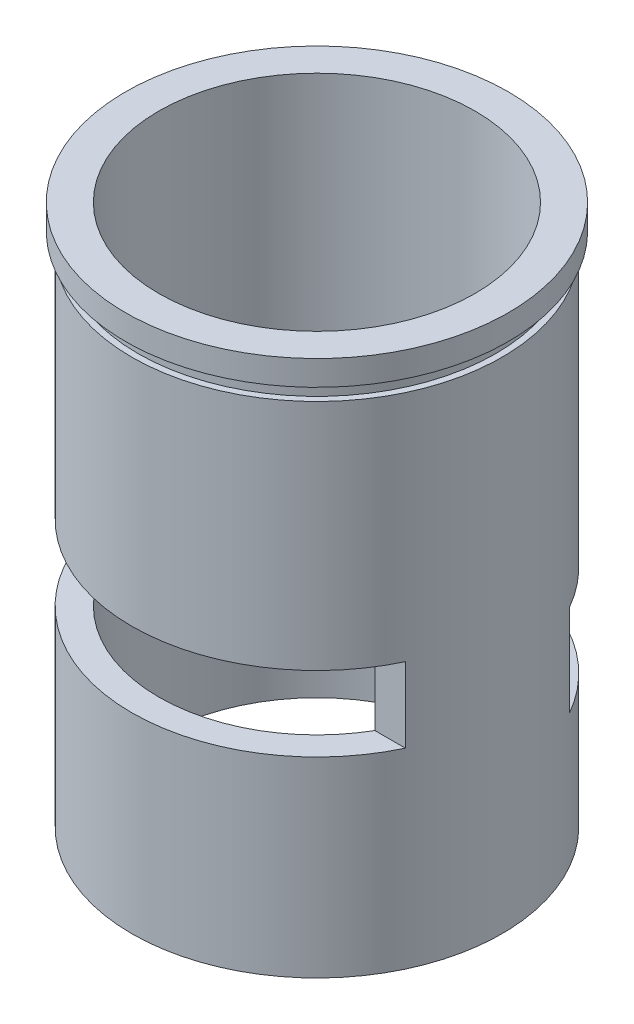
ISO-10303-21;
HEADER;
FILE_DESCRIPTION(('STEP AP214'),'2;1');
FILE_NAME('part.step','',(''),(''),'','','');
FILE_SCHEMA(('AUTOMOTIVE_DESIGN { 1 0 10303 214 1 1 1 1 }'));
ENDSEC;
DATA;
#1=APPLICATION_CONTEXT('core data for automotive mechanical design processes');
#2=APPLICATION_PROTOCOL_DEFINITION('international standard','automotive_design',2000,#1);
#3=PRODUCT_CONTEXT('',#1,'mechanical');
#4=PRODUCT('Part','Part','',(#3));
#5=PRODUCT_RELATED_PRODUCT_CATEGORY('part','',(#4));
#6=PRODUCT_DEFINITION_FORMATION('','',#4);
#7=PRODUCT_DEFINITION_CONTEXT('part definition',#1,'design');
#8=PRODUCT_DEFINITION('design','',#6,#7);
#9=PRODUCT_DEFINITION_SHAPE('','',#8);
#10=(LENGTH_UNIT() NAMED_UNIT(*) SI_UNIT(.MILLI.,.METRE.));
#11=(NAMED_UNIT(*) PLANE_ANGLE_UNIT() SI_UNIT($,.RADIAN.));
#12=(NAMED_UNIT(*) SI_UNIT($,.STERADIAN.) SOLID_ANGLE_UNIT());
#13=UNCERTAINTY_MEASURE_WITH_UNIT(LENGTH_MEASURE(1.E-05),#10,'distance_accuracy_value','');
#14=(GEOMETRIC_REPRESENTATION_CONTEXT(3) GLOBAL_UNCERTAINTY_ASSIGNED_CONTEXT((#13)) GLOBAL_UNIT_ASSIGNED_CONTEXT((#10,
#11,#12)) REPRESENTATION_CONTEXT('',''));
#15=CARTESIAN_POINT('',(0.,0.,0.));
#16=DIRECTION('',(0.,0.,1.));
#17=DIRECTION('',(1.,0.,0.));
#18=AXIS2_PLACEMENT_3D('',#15,#16,#17);
#19=CARTESIAN_POINT('',(11.5,49.,0.));
#20=DIRECTION('',(0.,-1.,0.));
#21=DIRECTION('',(0.,0.,-1.));
#22=AXIS2_PLACEMENT_3D('',#19,#20,#21);
#23=PLANE('',#22);
#24=CARTESIAN_POINT('',(0.,49.,0.));
#25=DIRECTION('',(0.,-1.,0.));
#26=DIRECTION('',(0.,0.,-1.));
#27=AXIS2_PLACEMENT_3D('',#24,#25,#26);
#28=CIRCLE('',#27,11.5);
#29=CARTESIAN_POINT('',(0.,49.,-11.5));
#30=VERTEX_POINT('',#29);
#31=EDGE_CURVE('E161',#30,#30,#28,.T.);
#32=ORIENTED_EDGE('',*,*,#31,.T.);
#33=EDGE_LOOP('',(#32));
#34=FACE_BOUND('',#33,.T.);
#35=CARTESIAN_POINT('',(0.,49.,0.));
#36=DIRECTION('',(0.,-1.,0.));
#37=DIRECTION('',(0.,0.,-1.));
#38=AXIS2_PLACEMENT_3D('',#35,#36,#37);
#39=CIRCLE('',#38,10.75);
#40=CARTESIAN_POINT('',(0.,49.,-10.75));
#41=VERTEX_POINT('',#40);
#42=EDGE_CURVE('E140',#41,#41,#39,.T.);
#43=ORIENTED_EDGE('',*,*,#42,.F.);
#44=EDGE_LOOP('',(#43));
#45=FACE_BOUND('',#44,.T.);
#46=ADVANCED_FACE('F31',(#34,#45),#23,.T.);
#47=CARTESIAN_POINT('',(0.,0.,0.));
#48=DIRECTION('',(0.,-1.,0.));
#49=DIRECTION('',(0.,0.,-1.));
#50=AXIS2_PLACEMENT_3D('',#47,#48,#49);
#51=CYLINDRICAL_SURFACE('',#50,11.5);
#52=CARTESIAN_POINT('',(0.,50.5,0.));
#53=DIRECTION('',(0.,-1.,0.));
#54=DIRECTION('',(0.,0.,-1.));
#55=AXIS2_PLACEMENT_3D('',#52,#53,#54);
#56=CIRCLE('',#55,11.5);
#57=CARTESIAN_POINT('',(0.,50.5,-11.5));
#58=VERTEX_POINT('',#57);
#59=EDGE_CURVE('E158',#58,#58,#56,.T.);
#60=ORIENTED_EDGE('',*,*,#59,.T.);
#61=EDGE_LOOP('',(#60));
#62=FACE_BOUND('',#61,.T.);
#63=ORIENTED_EDGE('',*,*,#31,.F.);
#64=EDGE_LOOP('',(#63));
#65=FACE_BOUND('',#64,.T.);
#66=ADVANCED_FACE('F196',(#62,#65),#51,.T.);
#67=CARTESIAN_POINT('',(11.5,50.5,0.));
#68=DIRECTION('',(0.,1.,0.));
#69=DIRECTION('',(0.,0.,1.));
#70=AXIS2_PLACEMENT_3D('',#67,#68,#69);
#71=PLANE('',#70);
#72=CARTESIAN_POINT('',(0.,50.5,0.));
#73=DIRECTION('',(0.,-1.,0.));
#74=DIRECTION('',(0.,0.,-1.));
#75=AXIS2_PLACEMENT_3D('',#72,#73,#74);
#76=CIRCLE('',#75,9.5);
#77=CARTESIAN_POINT('',(0.,50.5,-9.5));
#78=VERTEX_POINT('',#77);
#79=EDGE_CURVE('E155',#78,#78,#76,.T.);
#80=ORIENTED_EDGE('',*,*,#79,.T.);
#81=EDGE_LOOP('',(#80));
#82=FACE_BOUND('',#81,.T.);
#83=ORIENTED_EDGE('',*,*,#59,.F.);
#84=EDGE_LOOP('',(#83));
#85=FACE_BOUND('',#84,.T.);
#86=ADVANCED_FACE('F184',(#82,#85),#71,.T.);
#87=CARTESIAN_POINT('',(0.,0.,0.));
#88=DIRECTION('',(0.,-1.,0.));
#89=DIRECTION('',(0.,0.,-1.));
#90=AXIS2_PLACEMENT_3D('',#87,#88,#89);
#91=CYLINDRICAL_SURFACE('',#90,9.50000000000001);
#92=CARTESIAN_POINT('',(0.,26.,0.));
#93=DIRECTION('',(0.,-1.,0.));
#94=DIRECTION('',(0.,0.,-1.));
#95=AXIS2_PLACEMENT_3D('',#92,#93,#94);
#96=CIRCLE('',#95,9.50000000000001);
#97=CARTESIAN_POINT('',(-7.74596669241484,26.,-5.5));
#98=VERTEX_POINT('',#97);
#99=CARTESIAN_POINT('',(7.74596669241484,26.,-5.5));
#100=VERTEX_POINT('',#99);
#101=EDGE_CURVE('E124',#98,#100,#96,.T.);
#102=ORIENTED_EDGE('',*,*,#101,.F.);
#103=DIRECTION('',(0.,-1.,0.));
#104=VECTOR('',#103,1.);
#105=CARTESIAN_POINT('',(-7.74596669241484,0.,-5.5));
#106=LINE('',#105,#104);
#107=CARTESIAN_POINT('',(-7.74596669241484,31.5,-5.5));
#108=VERTEX_POINT('',#107);
#109=EDGE_CURVE('E122',#108,#98,#106,.T.);
#110=ORIENTED_EDGE('',*,*,#109,.F.);
#111=CARTESIAN_POINT('',(0.,31.5,0.));
#112=DIRECTION('',(0.,1.,0.));
#113=DIRECTION('',(0.,0.,1.));
#114=AXIS2_PLACEMENT_3D('',#111,#112,#113);
#115=CIRCLE('',#114,9.50000000000001);
#116=CARTESIAN_POINT('',(7.74596669241484,31.5,-5.5));
#117=VERTEX_POINT('',#116);
#118=EDGE_CURVE('E113',#117,#108,#115,.T.);
#119=ORIENTED_EDGE('',*,*,#118,.F.);
#120=DIRECTION('',(0.,-1.,0.));
#121=VECTOR('',#120,1.);
#122=CARTESIAN_POINT('',(7.74596669241484,0.,-5.5));
#123=LINE('',#122,#121);
#124=EDGE_CURVE('E120',#100,#117,#123,.F.);
#125=ORIENTED_EDGE('',*,*,#124,.F.);
#126=EDGE_LOOP('',(#102,#110,#119,#125));
#127=FACE_BOUND('',#126,.T.);
#128=CARTESIAN_POINT('',(0.,34.,0.));
#129=DIRECTION('',(0.,1.,0.));
#130=DIRECTION('',(0.,0.,1.));
#131=AXIS2_PLACEMENT_3D('',#128,#129,#130);
#132=CIRCLE('',#131,9.50000000000001);
#133=CARTESIAN_POINT('',(-8.22724133595217,34.,4.75));
#134=VERTEX_POINT('',#133);
#135=CARTESIAN_POINT('',(8.22724133595217,34.,4.75));
#136=VERTEX_POINT('',#135);
#137=EDGE_CURVE('E138',#134,#136,#132,.T.);
#138=ORIENTED_EDGE('',*,*,#137,.F.);
#139=DIRECTION('',(0.,-1.,0.));
#140=VECTOR('',#139,1.);
#141=CARTESIAN_POINT('',(-8.22724133595217,0.,4.75));
#142=LINE('',#141,#140);
#143=CARTESIAN_POINT('',(-8.22724133595217,29.5,4.75));
#144=VERTEX_POINT('',#143);
#145=EDGE_CURVE('E134',#144,#134,#142,.F.);
#146=ORIENTED_EDGE('',*,*,#145,.F.);
#147=CARTESIAN_POINT('',(0.,29.5,0.));
#148=DIRECTION('',(0.,-1.,0.));
#149=DIRECTION('',(0.,0.,-1.));
#150=AXIS2_PLACEMENT_3D('',#147,#148,#149);
#151=CIRCLE('',#150,9.50000000000001);
#152=CARTESIAN_POINT('',(8.22724133595217,29.5,4.75));
#153=VERTEX_POINT('',#152);
#154=EDGE_CURVE('E132',#153,#144,#151,.T.);
#155=ORIENTED_EDGE('',*,*,#154,.F.);
#156=DIRECTION('',(0.,-1.,0.));
#157=VECTOR('',#156,1.);
#158=CARTESIAN_POINT('',(8.22724133595217,0.,4.75));
#159=LINE('',#158,#157);
#160=EDGE_CURVE('E136',#136,#153,#159,.T.);
#161=ORIENTED_EDGE('',*,*,#160,.F.);
#162=EDGE_LOOP('',(#138,#146,#155,#161));
#163=FACE_BOUND('',#162,.T.);
#164=CARTESIAN_POINT('',(0.,18.,0.));
#165=DIRECTION('',(0.,-1.,0.));
#166=DIRECTION('',(0.,0.,-1.));
#167=AXIS2_PLACEMENT_3D('',#164,#165,#166);
#168=CIRCLE('',#167,9.50000000000001);
#169=CARTESIAN_POINT('',(0.,18.,-9.50000000000001));
#170=VERTEX_POINT('',#169);
#171=EDGE_CURVE('E152',#170,#170,#168,.T.);
#172=ORIENTED_EDGE('',*,*,#171,.T.);
#173=EDGE_LOOP('',(#172));
#174=FACE_BOUND('',#173,.T.);
#175=ORIENTED_EDGE('',*,*,#79,.F.);
#176=EDGE_LOOP('',(#175));
#177=FACE_BOUND('',#176,.T.);
#178=ADVANCED_FACE('F180',(#127,#163,#174,#177),#91,.F.);
#179=CARTESIAN_POINT('',(9.50000000000001,18.,0.));
#180=DIRECTION('',(0.,-1.,0.));
#181=DIRECTION('',(0.,0.,-1.));
#182=AXIS2_PLACEMENT_3D('',#179,#180,#181);
#183=PLANE('',#182);
#184=CARTESIAN_POINT('',(0.,18.,0.));
#185=DIRECTION('',(0.,-1.,0.));
#186=DIRECTION('',(0.,0.,-1.));
#187=AXIS2_PLACEMENT_3D('',#184,#185,#186);
#188=CIRCLE('',#187,11.125);
#189=CARTESIAN_POINT('',(0.,18.,-11.125));
#190=VERTEX_POINT('',#189);
#191=EDGE_CURVE('E149',#190,#190,#188,.T.);
#192=ORIENTED_EDGE('',*,*,#191,.T.);
#193=EDGE_LOOP('',(#192));
#194=FACE_BOUND('',#193,.T.);
#195=ORIENTED_EDGE('',*,*,#171,.F.);
#196=EDGE_LOOP('',(#195));
#197=FACE_BOUND('',#196,.T.);
#198=ADVANCED_FACE('F183',(#194,#197),#183,.T.);
#199=CARTESIAN_POINT('',(0.,0.,0.));
#200=DIRECTION('',(0.,-1.,0.));
#201=DIRECTION('',(0.,0.,-1.));
#202=AXIS2_PLACEMENT_3D('',#199,#200,#201);
#203=CYLINDRICAL_SURFACE('',#202,11.125);
#204=DIRECTION('',(0.,-1.,0.));
#205=VECTOR('',#204,1.);
#206=CARTESIAN_POINT('',(-9.67034771867073,0.,-5.5));
#207=LINE('',#206,#205);
#208=CARTESIAN_POINT('',(-9.67034771867073,26.,-5.5));
#209=VERTEX_POINT('',#208);
#210=CARTESIAN_POINT('',(-9.67034771867073,31.5,-5.5));
#211=VERTEX_POINT('',#210);
#212=EDGE_CURVE('E38',#209,#211,#207,.F.);
#213=ORIENTED_EDGE('',*,*,#212,.F.);
#214=CARTESIAN_POINT('',(0.,26.,0.));
#215=DIRECTION('',(0.,-1.,0.));
#216=DIRECTION('',(0.,0.,-1.));
#217=AXIS2_PLACEMENT_3D('',#214,#215,#216);
#218=CIRCLE('',#217,11.125);
#219=CARTESIAN_POINT('',(9.67034771867073,26.,-5.5));
#220=VERTEX_POINT('',#219);
#221=EDGE_CURVE('E11',#220,#209,#218,.F.);
#222=ORIENTED_EDGE('',*,*,#221,.F.);
#223=DIRECTION('',(0.,-1.,0.));
#224=VECTOR('',#223,1.);
#225=CARTESIAN_POINT('',(9.67034771867073,0.,-5.5));
#226=LINE('',#225,#224);
#227=CARTESIAN_POINT('',(9.67034771867073,31.5,-5.5));
#228=VERTEX_POINT('',#227);
#229=EDGE_CURVE('E99',#228,#220,#226,.T.);
#230=ORIENTED_EDGE('',*,*,#229,.F.);
#231=CARTESIAN_POINT('',(0.,31.5,0.));
#232=DIRECTION('',(0.,1.,0.));
#233=DIRECTION('',(0.,0.,1.));
#234=AXIS2_PLACEMENT_3D('',#231,#232,#233);
#235=CIRCLE('',#234,11.125);
#236=EDGE_CURVE('E94',#211,#228,#235,.F.);
#237=ORIENTED_EDGE('',*,*,#236,.F.);
#238=EDGE_LOOP('',(#213,#222,#230,#237));
#239=FACE_BOUND('',#238,.T.);
#240=DIRECTION('',(0.,-1.,0.));
#241=VECTOR('',#240,1.);
#242=CARTESIAN_POINT('',(-10.0599763916224,0.,4.75));
#243=LINE('',#242,#241);
#244=CARTESIAN_POINT('',(-10.0599763916224,34.,4.75));
#245=VERTEX_POINT('',#244);
#246=CARTESIAN_POINT('',(-10.0599763916224,29.5,4.75));
#247=VERTEX_POINT('',#246);
#248=EDGE_CURVE('E166',#245,#247,#243,.T.);
#249=ORIENTED_EDGE('',*,*,#248,.F.);
#250=CARTESIAN_POINT('',(0.,34.,0.));
#251=DIRECTION('',(0.,1.,0.));
#252=DIRECTION('',(0.,0.,1.));
#253=AXIS2_PLACEMENT_3D('',#250,#251,#252);
#254=CIRCLE('',#253,11.125);
#255=CARTESIAN_POINT('',(10.0599763916224,34.,4.75));
#256=VERTEX_POINT('',#255);
#257=EDGE_CURVE('E101',#256,#245,#254,.F.);
#258=ORIENTED_EDGE('',*,*,#257,.F.);
#259=DIRECTION('',(0.,-1.,0.));
#260=VECTOR('',#259,1.);
#261=CARTESIAN_POINT('',(10.0599763916224,0.,4.75));
#262=LINE('',#261,#260);
#263=CARTESIAN_POINT('',(10.0599763916224,29.5,4.75));
#264=VERTEX_POINT('',#263);
#265=EDGE_CURVE('E169',#264,#256,#262,.F.);
#266=ORIENTED_EDGE('',*,*,#265,.F.);
#267=CARTESIAN_POINT('',(0.,29.5,0.));
#268=DIRECTION('',(0.,-1.,0.));
#269=DIRECTION('',(0.,0.,-1.));
#270=AXIS2_PLACEMENT_3D('',#267,#268,#269);
#271=CIRCLE('',#270,11.125);
#272=EDGE_CURVE('E164',#247,#264,#271,.F.);
#273=ORIENTED_EDGE('',*,*,#272,.F.);
#274=EDGE_LOOP('',(#249,#258,#266,#273));
#275=FACE_BOUND('',#274,.T.);
#276=CARTESIAN_POINT('',(0.,48.,0.));
#277=DIRECTION('',(0.,-1.,0.));
#278=DIRECTION('',(0.,0.,-1.));
#279=AXIS2_PLACEMENT_3D('',#276,#277,#278);
#280=CIRCLE('',#279,11.125);
#281=CARTESIAN_POINT('',(0.,48.,-11.125));
#282=VERTEX_POINT('',#281);
#283=EDGE_CURVE('E146',#282,#282,#280,.T.);
#284=ORIENTED_EDGE('',*,*,#283,.T.);
#285=EDGE_LOOP('',(#284));
#286=FACE_BOUND('',#285,.T.);
#287=ORIENTED_EDGE('',*,*,#191,.F.);
#288=EDGE_LOOP('',(#287));
#289=FACE_BOUND('',#288,.T.);
#290=ADVANCED_FACE('F96',(#239,#275,#286,#289),#203,.T.);
#291=CARTESIAN_POINT('',(10.75,48.,0.));
#292=DIRECTION('',(0.,1.,0.));
#293=DIRECTION('',(0.,0.,1.));
#294=AXIS2_PLACEMENT_3D('',#291,#292,#293);
#295=PLANE('',#294);
#296=CARTESIAN_POINT('',(0.,48.,0.));
#297=DIRECTION('',(0.,-1.,0.));
#298=DIRECTION('',(0.,0.,-1.));
#299=AXIS2_PLACEMENT_3D('',#296,#297,#298);
#300=CIRCLE('',#299,10.75);
#301=CARTESIAN_POINT('',(0.,48.,-10.75));
#302=VERTEX_POINT('',#301);
#303=EDGE_CURVE('E143',#302,#302,#300,.T.);
#304=ORIENTED_EDGE('',*,*,#303,.T.);
#305=EDGE_LOOP('',(#304));
#306=FACE_BOUND('',#305,.T.);
#307=ORIENTED_EDGE('',*,*,#283,.F.);
#308=EDGE_LOOP('',(#307));
#309=FACE_BOUND('',#308,.T.);
#310=ADVANCED_FACE('F212',(#306,#309),#295,.T.);
#311=CARTESIAN_POINT('',(0.,0.,0.));
#312=DIRECTION('',(0.,-1.,0.));
#313=DIRECTION('',(0.,0.,-1.));
#314=AXIS2_PLACEMENT_3D('',#311,#312,#313);
#315=CYLINDRICAL_SURFACE('',#314,10.75);
#316=ORIENTED_EDGE('',*,*,#42,.T.);
#317=EDGE_LOOP('',(#316));
#318=FACE_BOUND('',#317,.T.);
#319=ORIENTED_EDGE('',*,*,#303,.F.);
#320=EDGE_LOOP('',(#319));
#321=FACE_BOUND('',#320,.T.);
#322=ADVANCED_FACE('F208',(#318,#321),#315,.T.);
#323=CARTESIAN_POINT('',(-11.5,34.,4.75));
#324=DIRECTION('',(0.,0.,-1.));
#325=DIRECTION('',(-1.,0.,0.));
#326=AXIS2_PLACEMENT_3D('',#323,#324,#325);
#327=PLANE('',#326);
#328=ORIENTED_EDGE('',*,*,#160,.T.);
#329=DIRECTION('',(1.,0.,0.));
#330=VECTOR('',#329,1.);
#331=CARTESIAN_POINT('',(-11.5,29.5,4.75));
#332=LINE('',#331,#330);
#333=EDGE_CURVE('E53',#153,#264,#332,.T.);
#334=ORIENTED_EDGE('',*,*,#333,.T.);
#335=ORIENTED_EDGE('',*,*,#265,.T.);
#336=DIRECTION('',(1.,0.,0.));
#337=VECTOR('',#336,1.);
#338=CARTESIAN_POINT('',(-11.5,34.,4.75));
#339=LINE('',#338,#337);
#340=EDGE_CURVE('E126',#136,#256,#339,.T.);
#341=ORIENTED_EDGE('',*,*,#340,.F.);
#342=EDGE_LOOP('',(#328,#334,#335,#341));
#343=FACE_BOUND('',#342,.T.);
#344=ADVANCED_FACE('F211',(#343),#327,.F.);
#345=CARTESIAN_POINT('',(-11.5,34.,11.125));
#346=DIRECTION('',(0.,1.,0.));
#347=DIRECTION('',(0.,0.,1.));
#348=AXIS2_PLACEMENT_3D('',#345,#346,#347);
#349=PLANE('',#348);
#350=ORIENTED_EDGE('',*,*,#137,.T.);
#351=ORIENTED_EDGE('',*,*,#340,.T.);
#352=ORIENTED_EDGE('',*,*,#257,.T.);
#353=EDGE_CURVE('E129',#245,#134,#339,.T.);
#354=ORIENTED_EDGE('',*,*,#353,.T.);
#355=EDGE_LOOP('',(#350,#351,#352,#354));
#356=FACE_BOUND('',#355,.T.);
#357=ADVANCED_FACE('F238',(#356),#349,.F.);
#358=ORIENTED_EDGE('',*,*,#145,.T.);
#359=ORIENTED_EDGE('',*,*,#353,.F.);
#360=ORIENTED_EDGE('',*,*,#248,.T.);
#361=EDGE_CURVE('E130',#247,#144,#332,.T.);
#362=ORIENTED_EDGE('',*,*,#361,.T.);
#363=EDGE_LOOP('',(#358,#359,#360,#362));
#364=FACE_BOUND('',#363,.T.);
#365=ADVANCED_FACE('F235',(#364),#327,.F.);
#366=CARTESIAN_POINT('',(-11.5,29.5,11.125));
#367=DIRECTION('',(0.,-1.,0.));
#368=DIRECTION('',(0.,0.,-1.));
#369=AXIS2_PLACEMENT_3D('',#366,#367,#368);
#370=PLANE('',#369);
#371=ORIENTED_EDGE('',*,*,#154,.T.);
#372=ORIENTED_EDGE('',*,*,#361,.F.);
#373=ORIENTED_EDGE('',*,*,#272,.T.);
#374=ORIENTED_EDGE('',*,*,#333,.F.);
#375=EDGE_LOOP('',(#371,#372,#373,#374));
#376=FACE_BOUND('',#375,.T.);
#377=ADVANCED_FACE('F232',(#376),#370,.F.);
#378=CARTESIAN_POINT('',(-11.5,31.5,-5.5));
#379=DIRECTION('',(0.,0.,1.));
#380=DIRECTION('',(1.,0.,0.));
#381=AXIS2_PLACEMENT_3D('',#378,#379,#380);
#382=PLANE('',#381);
#383=ORIENTED_EDGE('',*,*,#109,.T.);
#384=DIRECTION('',(1.,0.,0.));
#385=VECTOR('',#384,1.);
#386=CARTESIAN_POINT('',(-11.5,26.,-5.5));
#387=LINE('',#386,#385);
#388=EDGE_CURVE('E110',#209,#98,#387,.T.);
#389=ORIENTED_EDGE('',*,*,#388,.F.);
#390=ORIENTED_EDGE('',*,*,#212,.T.);
#391=DIRECTION('',(1.,0.,0.));
#392=VECTOR('',#391,1.);
#393=CARTESIAN_POINT('',(-11.5,31.5,-5.5));
#394=LINE('',#393,#392);
#395=EDGE_CURVE('E107',#211,#108,#394,.T.);
#396=ORIENTED_EDGE('',*,*,#395,.T.);
#397=EDGE_LOOP('',(#383,#389,#390,#396));
#398=FACE_BOUND('',#397,.T.);
#399=ADVANCED_FACE('F106',(#398),#382,.F.);
#400=CARTESIAN_POINT('',(-11.5,26.,-11.125));
#401=DIRECTION('',(0.,-1.,0.));
#402=DIRECTION('',(0.,0.,-1.));
#403=AXIS2_PLACEMENT_3D('',#400,#401,#402);
#404=PLANE('',#403);
#405=ORIENTED_EDGE('',*,*,#101,.T.);
#406=EDGE_CURVE('E114',#100,#220,#387,.T.);
#407=ORIENTED_EDGE('',*,*,#406,.T.);
#408=ORIENTED_EDGE('',*,*,#221,.T.);
#409=ORIENTED_EDGE('',*,*,#388,.T.);
#410=EDGE_LOOP('',(#405,#407,#408,#409));
#411=FACE_BOUND('',#410,.T.);
#412=ADVANCED_FACE('F177',(#411),#404,.F.);
#413=ORIENTED_EDGE('',*,*,#124,.T.);
#414=EDGE_CURVE('E45',#117,#228,#394,.T.);
#415=ORIENTED_EDGE('',*,*,#414,.T.);
#416=ORIENTED_EDGE('',*,*,#229,.T.);
#417=ORIENTED_EDGE('',*,*,#406,.F.);
#418=EDGE_LOOP('',(#413,#415,#416,#417));
#419=FACE_BOUND('',#418,.T.);
#420=ADVANCED_FACE('F174',(#419),#382,.F.);
#421=CARTESIAN_POINT('',(-11.5,31.5,-11.125));
#422=DIRECTION('',(0.,1.,0.));
#423=DIRECTION('',(0.,0.,1.));
#424=AXIS2_PLACEMENT_3D('',#421,#422,#423);
#425=PLANE('',#424);
#426=ORIENTED_EDGE('',*,*,#118,.T.);
#427=ORIENTED_EDGE('',*,*,#395,.F.);
#428=ORIENTED_EDGE('',*,*,#236,.T.);
#429=ORIENTED_EDGE('',*,*,#414,.F.);
#430=EDGE_LOOP('',(#426,#427,#428,#429));
#431=FACE_BOUND('',#430,.T.);
#432=ADVANCED_FACE('F111',(#431),#425,.F.);
#433=CLOSED_SHELL('',(#46,#66,#86,#178,#198,#290,#310,#322,#344,#357,#365,#377,#399,#412,#420,#432));
#434=MANIFOLD_SOLID_BREP('B2',#433);
#435=ADVANCED_BREP_SHAPE_REPRESENTATION('',(#18,#434),#14);
#436=SHAPE_DEFINITION_REPRESENTATION(#9,#435);
ENDSEC;
END-ISO-10303-21;
